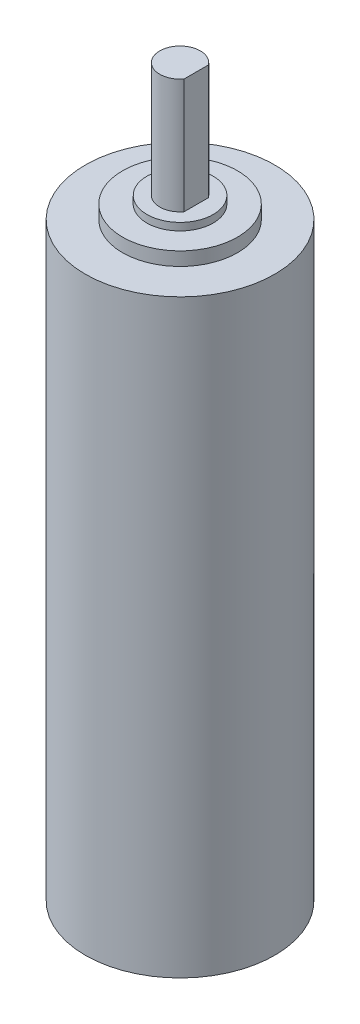
ISO-10303-21;
HEADER;
FILE_DESCRIPTION(('STEP AP214'),'2;1');
FILE_NAME('part.step','',(''),(''),'','','');
FILE_SCHEMA(('AUTOMOTIVE_DESIGN { 1 0 10303 214 1 1 1 1 }'));
ENDSEC;
DATA;
#1=APPLICATION_CONTEXT('core data for automotive mechanical design processes');
#2=APPLICATION_PROTOCOL_DEFINITION('international standard','automotive_design',2000,#1);
#3=PRODUCT_CONTEXT('',#1,'mechanical');
#4=PRODUCT('Part','Part','',(#3));
#5=PRODUCT_RELATED_PRODUCT_CATEGORY('part','',(#4));
#6=PRODUCT_DEFINITION_FORMATION('','',#4);
#7=PRODUCT_DEFINITION_CONTEXT('part definition',#1,'design');
#8=PRODUCT_DEFINITION('design','',#6,#7);
#9=PRODUCT_DEFINITION_SHAPE('','',#8);
#10=(LENGTH_UNIT() NAMED_UNIT(*) SI_UNIT(.MILLI.,.METRE.));
#11=(NAMED_UNIT(*) PLANE_ANGLE_UNIT() SI_UNIT($,.RADIAN.));
#12=(NAMED_UNIT(*) SI_UNIT($,.STERADIAN.) SOLID_ANGLE_UNIT());
#13=UNCERTAINTY_MEASURE_WITH_UNIT(LENGTH_MEASURE(1.E-05),#10,'distance_accuracy_value','');
#14=(GEOMETRIC_REPRESENTATION_CONTEXT(3) GLOBAL_UNCERTAINTY_ASSIGNED_CONTEXT((#13)) GLOBAL_UNIT_ASSIGNED_CONTEXT((#10,
#11,#12)) REPRESENTATION_CONTEXT('',''));
#15=CARTESIAN_POINT('',(0.,0.,0.));
#16=DIRECTION('',(0.,0.,1.));
#17=DIRECTION('',(1.,0.,0.));
#18=AXIS2_PLACEMENT_3D('',#15,#16,#17);
#19=CARTESIAN_POINT('',(0.,107.3,0.));
#20=DIRECTION('',(0.,1.,0.));
#21=DIRECTION('',(0.,0.,1.));
#22=AXIS2_PLACEMENT_3D('',#19,#20,#21);
#23=PLANE('',#22);
#24=CARTESIAN_POINT('',(0.,107.3,0.));
#25=DIRECTION('',(0.,1.,0.));
#26=DIRECTION('',(0.,0.,1.));
#27=AXIS2_PLACEMENT_3D('',#24,#25,#26);
#28=CIRCLE('',#27,3.);
#29=CARTESIAN_POINT('',(2.4,107.3,-1.8));
#30=VERTEX_POINT('',#29);
#31=CARTESIAN_POINT('',(2.4,107.3,1.8));
#32=VERTEX_POINT('',#31);
#33=EDGE_CURVE('E50',#30,#32,#28,.T.);
#34=ORIENTED_EDGE('',*,*,#33,.T.);
#35=DIRECTION('',(0.,0.,-1.));
#36=VECTOR('',#35,1.);
#37=CARTESIAN_POINT('',(2.4,107.3,0.));
#38=LINE('',#37,#36);
#39=EDGE_CURVE('E74',#32,#30,#38,.T.);
#40=ORIENTED_EDGE('',*,*,#39,.T.);
#41=EDGE_LOOP('',(#34,#40));
#42=FACE_BOUND('',#41,.T.);
#43=ADVANCED_FACE('F45',(#42),#23,.T.);
#44=CARTESIAN_POINT('',(0.,107.3,0.));
#45=DIRECTION('',(0.,-1.,0.));
#46=DIRECTION('',(0.,0.,-1.));
#47=AXIS2_PLACEMENT_3D('',#44,#45,#46);
#48=CYLINDRICAL_SURFACE('',#47,3.);
#49=CARTESIAN_POINT('',(0.,90.3,0.));
#50=DIRECTION('',(0.,1.,0.));
#51=DIRECTION('',(0.,0.,1.));
#52=AXIS2_PLACEMENT_3D('',#49,#50,#51);
#53=CIRCLE('',#52,3.);
#54=CARTESIAN_POINT('',(2.4,90.3,-1.8));
#55=VERTEX_POINT('',#54);
#56=CARTESIAN_POINT('',(2.4,90.3,1.8));
#57=VERTEX_POINT('',#56);
#58=EDGE_CURVE('E85',#55,#57,#53,.T.);
#59=ORIENTED_EDGE('',*,*,#58,.T.);
#60=DIRECTION('',(0.,1.,0.));
#61=VECTOR('',#60,1.);
#62=CARTESIAN_POINT('',(2.4,86.6503424818211,1.8));
#63=LINE('',#62,#61);
#64=EDGE_CURVE('E64',#57,#32,#63,.T.);
#65=ORIENTED_EDGE('',*,*,#64,.T.);
#66=ORIENTED_EDGE('',*,*,#33,.F.);
#67=DIRECTION('',(0.,1.,0.));
#68=VECTOR('',#67,1.);
#69=CARTESIAN_POINT('',(2.4,86.6503424818211,-1.8));
#70=LINE('',#69,#68);
#71=EDGE_CURVE('E76',#55,#30,#70,.T.);
#72=ORIENTED_EDGE('',*,*,#71,.F.);
#73=EDGE_LOOP('',(#59,#65,#66,#72));
#74=FACE_BOUND('',#73,.T.);
#75=ADVANCED_FACE('F83',(#74),#48,.T.);
#76=CARTESIAN_POINT('',(0.,90.3,0.));
#77=DIRECTION('',(0.,1.,0.));
#78=DIRECTION('',(0.,0.,1.));
#79=AXIS2_PLACEMENT_3D('',#76,#77,#78);
#80=PLANE('',#79);
#81=CARTESIAN_POINT('',(0.,90.3,0.));
#82=DIRECTION('',(0.,1.,0.));
#83=DIRECTION('',(0.,0.,1.));
#84=AXIS2_PLACEMENT_3D('',#81,#82,#83);
#85=CIRCLE('',#84,4.9);
#86=CARTESIAN_POINT('',(0.,90.3,4.9));
#87=VERTEX_POINT('',#86);
#88=EDGE_CURVE('E135',#87,#87,#85,.T.);
#89=ORIENTED_EDGE('',*,*,#88,.T.);
#90=EDGE_LOOP('',(#89));
#91=FACE_BOUND('',#90,.T.);
#92=ORIENTED_EDGE('',*,*,#58,.F.);
#93=DIRECTION('',(0.,0.,1.));
#94=VECTOR('',#93,1.);
#95=CARTESIAN_POINT('',(2.4,90.3,0.));
#96=LINE('',#95,#94);
#97=EDGE_CURVE('E68',#55,#57,#96,.T.);
#98=ORIENTED_EDGE('',*,*,#97,.T.);
#99=EDGE_LOOP('',(#92,#98));
#100=FACE_BOUND('',#99,.T.);
#101=ADVANCED_FACE('F112',(#91,#100),#80,.T.);
#102=CARTESIAN_POINT('',(0.,89.2,0.));
#103=DIRECTION('',(0.,1.,0.));
#104=DIRECTION('',(0.,0.,1.));
#105=AXIS2_PLACEMENT_3D('',#102,#103,#104);
#106=PLANE('',#105);
#107=CARTESIAN_POINT('',(0.,89.2,0.));
#108=DIRECTION('',(0.,1.,0.));
#109=DIRECTION('',(0.,0.,1.));
#110=AXIS2_PLACEMENT_3D('',#107,#108,#109);
#111=CIRCLE('',#110,8.5);
#112=CARTESIAN_POINT('',(0.,89.2,8.5));
#113=VERTEX_POINT('',#112);
#114=EDGE_CURVE('E155',#113,#113,#111,.T.);
#115=ORIENTED_EDGE('',*,*,#114,.T.);
#116=EDGE_LOOP('',(#115));
#117=FACE_BOUND('',#116,.T.);
#118=CARTESIAN_POINT('',(0.,89.2,0.));
#119=DIRECTION('',(0.,1.,0.));
#120=DIRECTION('',(0.,0.,1.));
#121=AXIS2_PLACEMENT_3D('',#118,#119,#120);
#122=CIRCLE('',#121,4.9);
#123=CARTESIAN_POINT('',(0.,89.2,4.9));
#124=VERTEX_POINT('',#123);
#125=EDGE_CURVE('E127',#124,#124,#122,.T.);
#126=ORIENTED_EDGE('',*,*,#125,.F.);
#127=EDGE_LOOP('',(#126));
#128=FACE_BOUND('',#127,.T.);
#129=ADVANCED_FACE('F169',(#117,#128),#106,.T.);
#130=CARTESIAN_POINT('',(0.,87.2,0.));
#131=DIRECTION('',(0.,1.,0.));
#132=DIRECTION('',(0.,0.,1.));
#133=AXIS2_PLACEMENT_3D('',#130,#131,#132);
#134=PLANE('',#133);
#135=CARTESIAN_POINT('',(0.,87.2,0.));
#136=DIRECTION('',(0.,1.,0.));
#137=DIRECTION('',(0.,0.,1.));
#138=AXIS2_PLACEMENT_3D('',#135,#136,#137);
#139=CIRCLE('',#138,14.);
#140=CARTESIAN_POINT('',(0.,87.2,14.));
#141=VERTEX_POINT('',#140);
#142=EDGE_CURVE('E12',#141,#141,#139,.T.);
#143=ORIENTED_EDGE('',*,*,#142,.T.);
#144=EDGE_LOOP('',(#143));
#145=FACE_BOUND('',#144,.T.);
#146=CARTESIAN_POINT('',(0.,87.2,0.));
#147=DIRECTION('',(0.,1.,0.));
#148=DIRECTION('',(0.,0.,1.));
#149=AXIS2_PLACEMENT_3D('',#146,#147,#148);
#150=CIRCLE('',#149,8.5);
#151=CARTESIAN_POINT('',(0.,87.2,8.5));
#152=VERTEX_POINT('',#151);
#153=EDGE_CURVE('E148',#152,#152,#150,.T.);
#154=ORIENTED_EDGE('',*,*,#153,.F.);
#155=EDGE_LOOP('',(#154));
#156=FACE_BOUND('',#155,.T.);
#157=ADVANCED_FACE('F47',(#145,#156),#134,.T.);
#158=CARTESIAN_POINT('',(0.,0.,0.));
#159=DIRECTION('',(0.,1.,0.));
#160=DIRECTION('',(0.,0.,1.));
#161=AXIS2_PLACEMENT_3D('',#158,#159,#160);
#162=PLANE('',#161);
#163=CARTESIAN_POINT('',(0.,0.,0.));
#164=DIRECTION('',(0.,1.,0.));
#165=DIRECTION('',(0.,0.,1.));
#166=AXIS2_PLACEMENT_3D('',#163,#164,#165);
#167=CIRCLE('',#166,14.);
#168=CARTESIAN_POINT('',(0.,0.,14.));
#169=VERTEX_POINT('',#168);
#170=EDGE_CURVE('E56',#169,#169,#167,.T.);
#171=ORIENTED_EDGE('',*,*,#170,.F.);
#172=EDGE_LOOP('',(#171));
#173=FACE_BOUND('',#172,.T.);
#174=ADVANCED_FACE('F174',(#173),#162,.F.);
#175=CARTESIAN_POINT('',(0.,0.,0.));
#176=DIRECTION('',(0.,1.,0.));
#177=DIRECTION('',(0.,0.,1.));
#178=AXIS2_PLACEMENT_3D('',#175,#176,#177);
#179=CYLINDRICAL_SURFACE('',#178,14.);
#180=ORIENTED_EDGE('',*,*,#142,.F.);
#181=EDGE_LOOP('',(#180));
#182=FACE_BOUND('',#181,.T.);
#183=ORIENTED_EDGE('',*,*,#170,.T.);
#184=EDGE_LOOP('',(#183));
#185=FACE_BOUND('',#184,.T.);
#186=ADVANCED_FACE('F168',(#182,#185),#179,.T.);
#187=CARTESIAN_POINT('',(0.,87.2,0.));
#188=DIRECTION('',(0.,1.,0.));
#189=DIRECTION('',(0.,0.,1.));
#190=AXIS2_PLACEMENT_3D('',#187,#188,#189);
#191=CYLINDRICAL_SURFACE('',#190,8.5);
#192=ORIENTED_EDGE('',*,*,#114,.F.);
#193=EDGE_LOOP('',(#192));
#194=FACE_BOUND('',#193,.T.);
#195=ORIENTED_EDGE('',*,*,#153,.T.);
#196=EDGE_LOOP('',(#195));
#197=FACE_BOUND('',#196,.T.);
#198=ADVANCED_FACE('F117',(#194,#197),#191,.T.);
#199=CARTESIAN_POINT('',(0.,89.2,0.));
#200=DIRECTION('',(0.,1.,0.));
#201=DIRECTION('',(0.,0.,1.));
#202=AXIS2_PLACEMENT_3D('',#199,#200,#201);
#203=CYLINDRICAL_SURFACE('',#202,4.9);
#204=ORIENTED_EDGE('',*,*,#88,.F.);
#205=EDGE_LOOP('',(#204));
#206=FACE_BOUND('',#205,.T.);
#207=ORIENTED_EDGE('',*,*,#125,.T.);
#208=EDGE_LOOP('',(#207));
#209=FACE_BOUND('',#208,.T.);
#210=ADVANCED_FACE('F113',(#206,#209),#203,.T.);
#211=CARTESIAN_POINT('',(2.4,86.6503424818211,0.));
#212=DIRECTION('',(1.,0.,0.));
#213=DIRECTION('',(0.,0.,-1.));
#214=AXIS2_PLACEMENT_3D('',#211,#212,#213);
#215=PLANE('',#214);
#216=ORIENTED_EDGE('',*,*,#71,.T.);
#217=ORIENTED_EDGE('',*,*,#39,.F.);
#218=ORIENTED_EDGE('',*,*,#64,.F.);
#219=ORIENTED_EDGE('',*,*,#97,.F.);
#220=EDGE_LOOP('',(#216,#217,#218,#219));
#221=FACE_BOUND('',#220,.T.);
#222=ADVANCED_FACE('F75',(#221),#215,.T.);
#223=CLOSED_SHELL('',(#43,#75,#101,#129,#157,#174,#186,#198,#210,#222));
#224=MANIFOLD_SOLID_BREP('B2',#223);
#225=ADVANCED_BREP_SHAPE_REPRESENTATION('',(#18,#224),#14);
#226=SHAPE_DEFINITION_REPRESENTATION(#9,#225);
ENDSEC;
END-ISO-10303-21;
